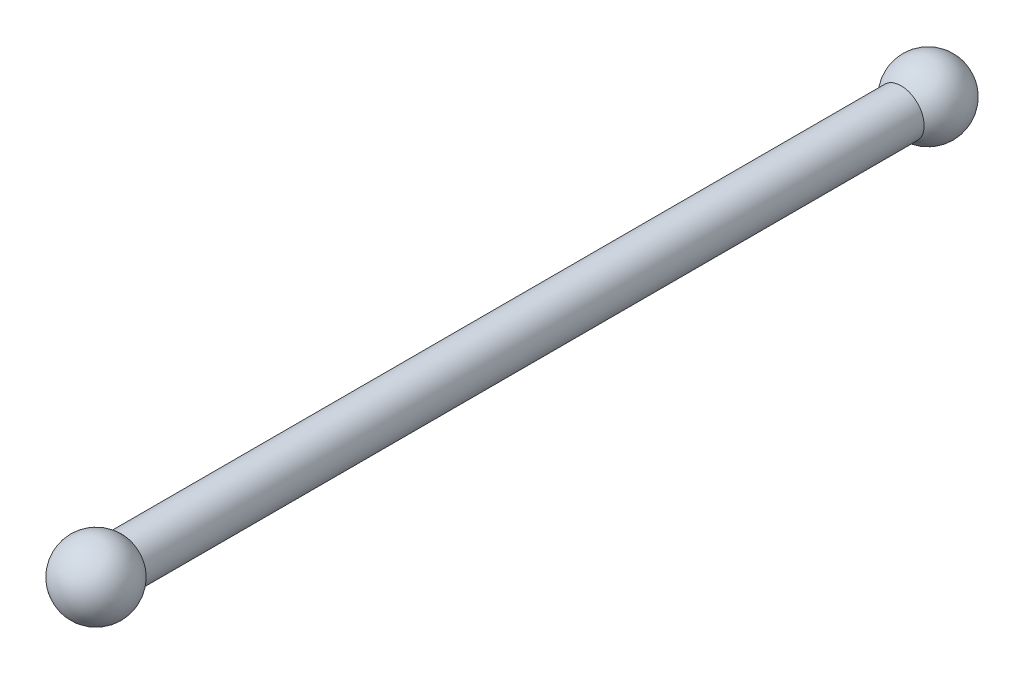
ISO-10303-21;
HEADER;
FILE_DESCRIPTION(('STEP AP214'),'2;1');
FILE_NAME('part.step','',(''),(''),'','','');
FILE_SCHEMA(('AUTOMOTIVE_DESIGN { 1 0 10303 214 1 1 1 1 }'));
ENDSEC;
DATA;
#1=APPLICATION_CONTEXT('core data for automotive mechanical design processes');
#2=APPLICATION_PROTOCOL_DEFINITION('international standard','automotive_design',2000,#1);
#3=PRODUCT_CONTEXT('',#1,'mechanical');
#4=PRODUCT('Part','Part','',(#3));
#5=PRODUCT_RELATED_PRODUCT_CATEGORY('part','',(#4));
#6=PRODUCT_DEFINITION_FORMATION('','',#4);
#7=PRODUCT_DEFINITION_CONTEXT('part definition',#1,'design');
#8=PRODUCT_DEFINITION('design','',#6,#7);
#9=PRODUCT_DEFINITION_SHAPE('','',#8);
#10=(LENGTH_UNIT() NAMED_UNIT(*) SI_UNIT(.MILLI.,.METRE.));
#11=(NAMED_UNIT(*) PLANE_ANGLE_UNIT() SI_UNIT($,.RADIAN.));
#12=(NAMED_UNIT(*) SI_UNIT($,.STERADIAN.) SOLID_ANGLE_UNIT());
#13=UNCERTAINTY_MEASURE_WITH_UNIT(LENGTH_MEASURE(1.E-05),#10,'distance_accuracy_value','');
#14=(GEOMETRIC_REPRESENTATION_CONTEXT(3) GLOBAL_UNCERTAINTY_ASSIGNED_CONTEXT((#13)) GLOBAL_UNIT_ASSIGNED_CONTEXT((#10,
#11,#12)) REPRESENTATION_CONTEXT('',''));
#15=CARTESIAN_POINT('',(0.,0.,0.));
#16=DIRECTION('',(0.,0.,1.));
#17=DIRECTION('',(1.,0.,0.));
#18=AXIS2_PLACEMENT_3D('',#15,#16,#17);
#19=CARTESIAN_POINT('',(0.,6.5,-10.));
#20=DIRECTION('',(0.,0.,-1.));
#21=DIRECTION('',(0.,-1.,0.));
#22=AXIS2_PLACEMENT_3D('',#19,#20,#21);
#23=SPHERICAL_SURFACE('',#22,10.);
#24=CARTESIAN_POINT('',(0.,6.5,-2.40065792321466));
#25=DIRECTION('',(0.,0.,-1.));
#26=DIRECTION('',(0.,1.,0.));
#27=AXIS2_PLACEMENT_3D('',#24,#25,#26);
#28=CIRCLE('',#27,6.5);
#29=CARTESIAN_POINT('',(0.,13.,-2.40065792321466));
#30=VERTEX_POINT('',#29);
#31=EDGE_CURVE('E10',#30,#30,#28,.T.);
#32=ORIENTED_EDGE('',*,*,#31,.T.);
#33=EDGE_LOOP('',(#32));
#34=FACE_BOUND('',#33,.T.);
#35=ADVANCED_FACE('F34',(#34),#23,.T.);
#36=CARTESIAN_POINT('',(0.,6.49999999999997,224.59934208));
#37=DIRECTION('',(0.,0.,-1.));
#38=DIRECTION('',(0.,1.,0.));
#39=AXIS2_PLACEMENT_3D('',#36,#37,#38);
#40=SPHERICAL_SURFACE('',#39,10.);
#41=CARTESIAN_POINT('',(0.,6.49999999999997,217.000000003215));
#42=DIRECTION('',(0.,0.,-1.));
#43=DIRECTION('',(0.,1.,0.));
#44=AXIS2_PLACEMENT_3D('',#41,#42,#43);
#45=CIRCLE('',#44,6.5);
#46=CARTESIAN_POINT('',(0.,13.,217.000000003215));
#47=VERTEX_POINT('',#46);
#48=EDGE_CURVE('E40',#47,#47,#45,.T.);
#49=ORIENTED_EDGE('',*,*,#48,.F.);
#50=EDGE_LOOP('',(#49));
#51=FACE_BOUND('',#50,.T.);
#52=ADVANCED_FACE('F48',(#51),#40,.T.);
#53=CARTESIAN_POINT('',(0.,6.5,0.));
#54=DIRECTION('',(0.,0.,-1.));
#55=DIRECTION('',(0.,1.,0.));
#56=AXIS2_PLACEMENT_3D('',#53,#54,#55);
#57=CYLINDRICAL_SURFACE('',#56,6.5);
#58=ORIENTED_EDGE('',*,*,#31,.F.);
#59=EDGE_LOOP('',(#58));
#60=FACE_BOUND('',#59,.T.);
#61=ORIENTED_EDGE('',*,*,#48,.T.);
#62=EDGE_LOOP('',(#61));
#63=FACE_BOUND('',#62,.T.);
#64=ADVANCED_FACE('F46',(#60,#63),#57,.T.);
#65=CLOSED_SHELL('',(#35,#52,#64));
#66=MANIFOLD_SOLID_BREP('B2',#65);
#67=ADVANCED_BREP_SHAPE_REPRESENTATION('',(#18,#66),#14);
#68=SHAPE_DEFINITION_REPRESENTATION(#9,#67);
ENDSEC;
END-ISO-10303-21;
